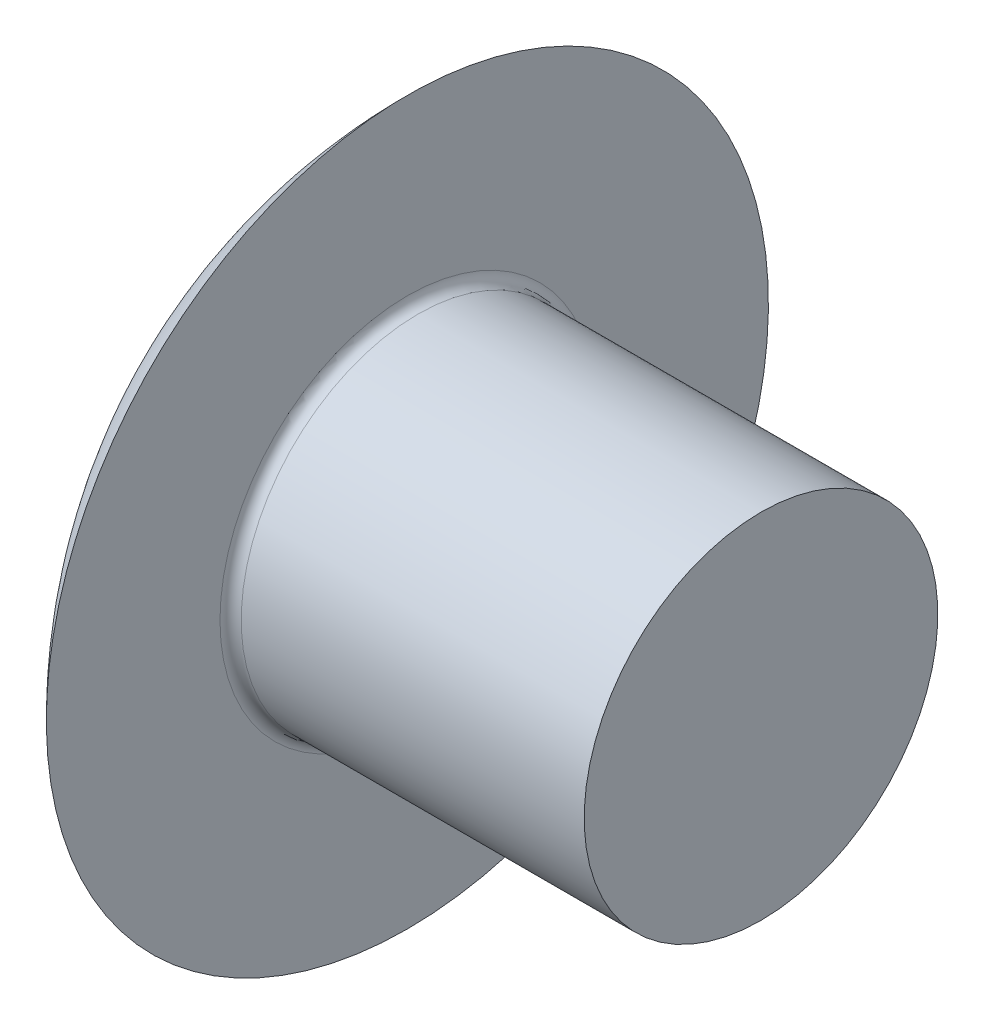
ISO-10303-21;
HEADER;
FILE_DESCRIPTION(('STEP AP214'),'2;1');
FILE_NAME('part.step','',(''),(''),'','','');
FILE_SCHEMA(('AUTOMOTIVE_DESIGN { 1 0 10303 214 1 1 1 1 }'));
ENDSEC;
DATA;
#1=APPLICATION_CONTEXT('core data for automotive mechanical design processes');
#2=APPLICATION_PROTOCOL_DEFINITION('international standard','automotive_design',2000,#1);
#3=PRODUCT_CONTEXT('',#1,'mechanical');
#4=PRODUCT('Part','Part','',(#3));
#5=PRODUCT_RELATED_PRODUCT_CATEGORY('part','',(#4));
#6=PRODUCT_DEFINITION_FORMATION('','',#4);
#7=PRODUCT_DEFINITION_CONTEXT('part definition',#1,'design');
#8=PRODUCT_DEFINITION('design','',#6,#7);
#9=PRODUCT_DEFINITION_SHAPE('','',#8);
#10=(LENGTH_UNIT() NAMED_UNIT(*) SI_UNIT(.MILLI.,.METRE.));
#11=(NAMED_UNIT(*) PLANE_ANGLE_UNIT() SI_UNIT($,.RADIAN.));
#12=(NAMED_UNIT(*) SI_UNIT($,.STERADIAN.) SOLID_ANGLE_UNIT());
#13=UNCERTAINTY_MEASURE_WITH_UNIT(LENGTH_MEASURE(1.E-05),#10,'distance_accuracy_value','');
#14=(GEOMETRIC_REPRESENTATION_CONTEXT(3) GLOBAL_UNCERTAINTY_ASSIGNED_CONTEXT((#13)) GLOBAL_UNIT_ASSIGNED_CONTEXT((#10,
#11,#12)) REPRESENTATION_CONTEXT('',''));
#15=CARTESIAN_POINT('',(0.,0.,0.));
#16=DIRECTION('',(0.,0.,1.));
#17=DIRECTION('',(1.,0.,0.));
#18=AXIS2_PLACEMENT_3D('',#15,#16,#17);
#19=CARTESIAN_POINT('',(4.54,0.,0.));
#20=DIRECTION('',(-1.,0.,0.));
#21=DIRECTION('',(0.,-1.,0.));
#22=AXIS2_PLACEMENT_3D('',#19,#20,#21);
#23=TOROIDAL_SURFACE('',#22,5.3,0.3);
#24=CARTESIAN_POINT('',(4.24,0.,0.));
#25=DIRECTION('',(-1.,0.,0.));
#26=DIRECTION('',(0.,-1.,0.));
#27=AXIS2_PLACEMENT_3D('',#24,#25,#26);
#28=CIRCLE('',#27,5.3);
#29=CARTESIAN_POINT('',(4.24,-5.3,0.));
#30=VERTEX_POINT('',#29);
#31=EDGE_CURVE('E11',#30,#30,#28,.T.);
#32=ORIENTED_EDGE('',*,*,#31,.F.);
#33=EDGE_LOOP('',(#32));
#34=FACE_BOUND('',#33,.T.);
#35=CARTESIAN_POINT('',(4.54,0.,0.));
#36=DIRECTION('',(-1.,0.,0.));
#37=DIRECTION('',(0.,-1.,0.));
#38=AXIS2_PLACEMENT_3D('',#35,#36,#37);
#39=CIRCLE('',#38,5.);
#40=CARTESIAN_POINT('',(4.54,-5.,0.));
#41=VERTEX_POINT('',#40);
#42=EDGE_CURVE('E58',#41,#41,#39,.T.);
#43=ORIENTED_EDGE('',*,*,#42,.T.);
#44=EDGE_LOOP('',(#43));
#45=FACE_BOUND('',#44,.T.);
#46=ADVANCED_FACE('F38',(#34,#45),#23,.F.);
#47=CARTESIAN_POINT('',(4.24,10.21,0.));
#48=DIRECTION('',(-1.,0.,0.));
#49=DIRECTION('',(0.,-1.,0.));
#50=AXIS2_PLACEMENT_3D('',#47,#48,#49);
#51=PLANE('',#50);
#52=CARTESIAN_POINT('',(4.24,0.,0.));
#53=DIRECTION('',(-1.,0.,0.));
#54=DIRECTION('',(0.,-1.,0.));
#55=AXIS2_PLACEMENT_3D('',#52,#53,#54);
#56=CIRCLE('',#55,10.21);
#57=CARTESIAN_POINT('',(4.24,-10.21,0.));
#58=VERTEX_POINT('',#57);
#59=EDGE_CURVE('E44',#58,#58,#56,.T.);
#60=ORIENTED_EDGE('',*,*,#59,.F.);
#61=EDGE_LOOP('',(#60));
#62=FACE_BOUND('',#61,.T.);
#63=ORIENTED_EDGE('',*,*,#31,.T.);
#64=EDGE_LOOP('',(#63));
#65=FACE_BOUND('',#64,.T.);
#66=ADVANCED_FACE('F51',(#62,#65),#51,.F.);
#67=CARTESIAN_POINT('',(14.4999549694165,0.0361370294148653,0.));
#68=DIRECTION('',(0.,0.,-1.));
#69=DIRECTION('',(0.,-1.,0.));
#70=AXIS2_PLACEMENT_3D('',#67,#68,#69);
#71=CIRCLE('',#70,14.5);
#72=TRIMMED_CURVE('',#71,(PARAMETER_VALUE(-1.56830411528983)),
(PARAMETER_VALUE(1.56830411528983)),.T.,.PARAMETER.);
#73=CARTESIAN_POINT('',(14.4999549694165,0.,0.));
#74=DIRECTION('',(-1.,0.,0.));
#75=AXIS1_PLACEMENT('',#73,#74);
#76=SURFACE_OF_REVOLUTION('',#72,#75);
#77=CARTESIAN_POINT('',(0.,0.,0.));
#78=VERTEX_POINT('',#77);
#79=VERTEX_LOOP('',#78);
#80=FACE_BOUND('',#79,.T.);
#81=ORIENTED_EDGE('',*,*,#59,.T.);
#82=EDGE_LOOP('',(#81));
#83=FACE_BOUND('',#82,.T.);
#84=ADVANCED_FACE('F47',(#80,#83),#76,.T.);
#85=CARTESIAN_POINT('',(14.24,5.,0.));
#86=DIRECTION('',(-1.,0.,0.));
#87=DIRECTION('',(0.,-1.,0.));
#88=AXIS2_PLACEMENT_3D('',#85,#86,#87);
#89=PLANE('',#88);
#90=CARTESIAN_POINT('',(14.24,0.,0.));
#91=DIRECTION('',(-1.,0.,0.));
#92=DIRECTION('',(0.,-1.,0.));
#93=AXIS2_PLACEMENT_3D('',#90,#91,#92);
#94=CIRCLE('',#93,5.);
#95=CARTESIAN_POINT('',(14.24,-5.,0.));
#96=VERTEX_POINT('',#95);
#97=EDGE_CURVE('E56',#96,#96,#94,.T.);
#98=ORIENTED_EDGE('',*,*,#97,.F.);
#99=EDGE_LOOP('',(#98));
#100=FACE_BOUND('',#99,.T.);
#101=ADVANCED_FACE('F50',(#100),#89,.F.);
#102=CARTESIAN_POINT('',(0.,0.,0.));
#103=DIRECTION('',(-1.,0.,0.));
#104=DIRECTION('',(0.,-1.,0.));
#105=AXIS2_PLACEMENT_3D('',#102,#103,#104);
#106=CYLINDRICAL_SURFACE('',#105,5.);
#107=ORIENTED_EDGE('',*,*,#42,.F.);
#108=EDGE_LOOP('',(#107));
#109=FACE_BOUND('',#108,.T.);
#110=ORIENTED_EDGE('',*,*,#97,.T.);
#111=EDGE_LOOP('',(#110));
#112=FACE_BOUND('',#111,.T.);
#113=ADVANCED_FACE('F65',(#109,#112),#106,.T.);
#114=CLOSED_SHELL('',(#46,#66,#84,#101,#113));
#115=MANIFOLD_SOLID_BREP('B2',#114);
#116=ADVANCED_BREP_SHAPE_REPRESENTATION('',(#18,#115),#14);
#117=SHAPE_DEFINITION_REPRESENTATION(#9,#116);
ENDSEC;
END-ISO-10303-21;
